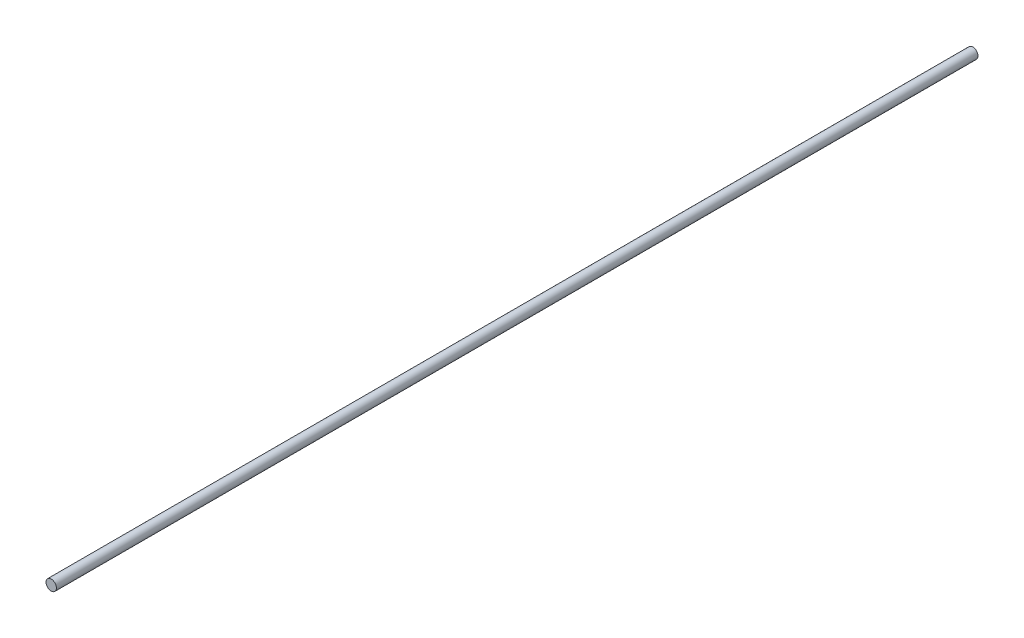
ISO-10303-21;
HEADER;
FILE_DESCRIPTION(('STEP AP214'),'2;1');
FILE_NAME('part.step','',(''),(''),'','','');
FILE_SCHEMA(('AUTOMOTIVE_DESIGN { 1 0 10303 214 1 1 1 1 }'));
ENDSEC;
DATA;
#1=APPLICATION_CONTEXT('core data for automotive mechanical design processes');
#2=APPLICATION_PROTOCOL_DEFINITION('international standard','automotive_design',2000,#1);
#3=PRODUCT_CONTEXT('',#1,'mechanical');
#4=PRODUCT('Part','Part','',(#3));
#5=PRODUCT_RELATED_PRODUCT_CATEGORY('part','',(#4));
#6=PRODUCT_DEFINITION_FORMATION('','',#4);
#7=PRODUCT_DEFINITION_CONTEXT('part definition',#1,'design');
#8=PRODUCT_DEFINITION('design','',#6,#7);
#9=PRODUCT_DEFINITION_SHAPE('','',#8);
#10=(LENGTH_UNIT() NAMED_UNIT(*) SI_UNIT(.MILLI.,.METRE.));
#11=(NAMED_UNIT(*) PLANE_ANGLE_UNIT() SI_UNIT($,.RADIAN.));
#12=(NAMED_UNIT(*) SI_UNIT($,.STERADIAN.) SOLID_ANGLE_UNIT());
#13=UNCERTAINTY_MEASURE_WITH_UNIT(LENGTH_MEASURE(1.E-05),#10,'distance_accuracy_value','');
#14=(GEOMETRIC_REPRESENTATION_CONTEXT(3) GLOBAL_UNCERTAINTY_ASSIGNED_CONTEXT((#13)) GLOBAL_UNIT_ASSIGNED_CONTEXT((#10,
#11,#12)) REPRESENTATION_CONTEXT('',''));
#15=CARTESIAN_POINT('',(0.,0.,0.));
#16=DIRECTION('',(0.,0.,1.));
#17=DIRECTION('',(1.,0.,0.));
#18=AXIS2_PLACEMENT_3D('',#15,#16,#17);
#19=CARTESIAN_POINT('',(0.,0.,2254.25));
#20=DIRECTION('',(0.,0.,-1.));
#21=DIRECTION('',(-1.,0.,0.));
#22=AXIS2_PLACEMENT_3D('',#19,#20,#21);
#23=CYLINDRICAL_SURFACE('',#22,7.9375);
#24=CARTESIAN_POINT('',(0.,0.,596.9));
#25=DIRECTION('',(0.,0.,-1.));
#26=DIRECTION('',(-1.,0.,0.));
#27=AXIS2_PLACEMENT_3D('',#24,#25,#26);
#28=CIRCLE('',#27,7.9375);
#29=CARTESIAN_POINT('',(-7.9375,0.,596.9));
#30=VERTEX_POINT('',#29);
#31=EDGE_CURVE('E10',#30,#30,#28,.T.);
#32=ORIENTED_EDGE('',*,*,#31,.F.);
#33=EDGE_LOOP('',(#32));
#34=FACE_BOUND('',#33,.T.);
#35=CARTESIAN_POINT('',(0.,0.,2000.25));
#36=DIRECTION('',(0.,0.,1.));
#37=DIRECTION('',(1.,0.,0.));
#38=AXIS2_PLACEMENT_3D('',#35,#36,#37);
#39=CIRCLE('',#38,7.9375);
#40=CARTESIAN_POINT('',(7.9375,0.,2000.25));
#41=VERTEX_POINT('',#40);
#42=EDGE_CURVE('E48',#41,#41,#39,.T.);
#43=ORIENTED_EDGE('',*,*,#42,.F.);
#44=EDGE_LOOP('',(#43));
#45=FACE_BOUND('',#44,.T.);
#46=ADVANCED_FACE('F41',(#34,#45),#23,.T.);
#47=CARTESIAN_POINT('',(0.,0.,596.9));
#48=DIRECTION('',(0.,0.,-1.));
#49=DIRECTION('',(-1.,0.,0.));
#50=AXIS2_PLACEMENT_3D('',#47,#48,#49);
#51=PLANE('',#50);
#52=ORIENTED_EDGE('',*,*,#31,.T.);
#53=EDGE_LOOP('',(#52));
#54=FACE_BOUND('',#53,.T.);
#55=ADVANCED_FACE('F58',(#54),#51,.T.);
#56=CARTESIAN_POINT('',(0.,0.,2000.25));
#57=DIRECTION('',(0.,0.,1.));
#58=DIRECTION('',(1.,0.,0.));
#59=AXIS2_PLACEMENT_3D('',#56,#57,#58);
#60=PLANE('',#59);
#61=ORIENTED_EDGE('',*,*,#42,.T.);
#62=EDGE_LOOP('',(#61));
#63=FACE_BOUND('',#62,.T.);
#64=ADVANCED_FACE('F55',(#63),#60,.T.);
#65=CLOSED_SHELL('',(#46,#55,#64));
#66=MANIFOLD_SOLID_BREP('B2',#65);
#67=ADVANCED_BREP_SHAPE_REPRESENTATION('',(#18,#66),#14);
#68=SHAPE_DEFINITION_REPRESENTATION(#9,#67);
ENDSEC;
END-ISO-10303-21;
